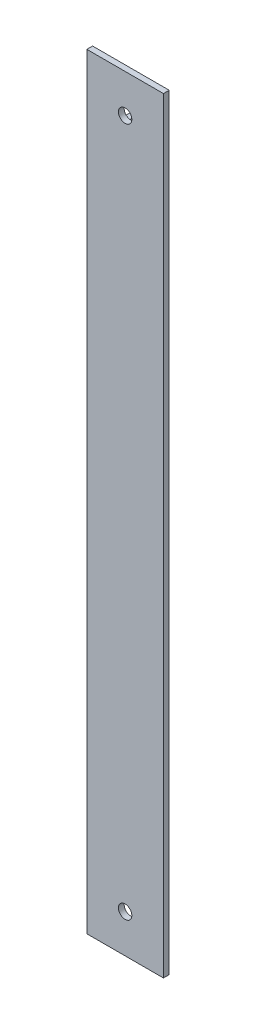
ISO-10303-21;
HEADER;
FILE_DESCRIPTION(('STEP AP214'),'2;1');
FILE_NAME('part.step','',(''),(''),'','','');
FILE_SCHEMA(('AUTOMOTIVE_DESIGN { 1 0 10303 214 1 1 1 1 }'));
ENDSEC;
DATA;
#1=APPLICATION_CONTEXT('core data for automotive mechanical design processes');
#2=APPLICATION_PROTOCOL_DEFINITION('international standard','automotive_design',2000,#1);
#3=PRODUCT_CONTEXT('',#1,'mechanical');
#4=PRODUCT('Part','Part','',(#3));
#5=PRODUCT_RELATED_PRODUCT_CATEGORY('part','',(#4));
#6=PRODUCT_DEFINITION_FORMATION('','',#4);
#7=PRODUCT_DEFINITION_CONTEXT('part definition',#1,'design');
#8=PRODUCT_DEFINITION('design','',#6,#7);
#9=PRODUCT_DEFINITION_SHAPE('','',#8);
#10=(LENGTH_UNIT() NAMED_UNIT(*) SI_UNIT(.MILLI.,.METRE.));
#11=(NAMED_UNIT(*) PLANE_ANGLE_UNIT() SI_UNIT($,.RADIAN.));
#12=(NAMED_UNIT(*) SI_UNIT($,.STERADIAN.) SOLID_ANGLE_UNIT());
#13=UNCERTAINTY_MEASURE_WITH_UNIT(LENGTH_MEASURE(1.E-05),#10,'distance_accuracy_value','');
#14=(GEOMETRIC_REPRESENTATION_CONTEXT(3) GLOBAL_UNCERTAINTY_ASSIGNED_CONTEXT((#13)) GLOBAL_UNIT_ASSIGNED_CONTEXT((#10,
#11,#12)) REPRESENTATION_CONTEXT('',''));
#15=CARTESIAN_POINT('',(0.,0.,0.));
#16=DIRECTION('',(0.,0.,1.));
#17=DIRECTION('',(1.,0.,0.));
#18=AXIS2_PLACEMENT_3D('',#15,#16,#17);
#19=CARTESIAN_POINT('',(1.5,200.,-20.));
#20=DIRECTION('',(-1.,0.,0.));
#21=DIRECTION('',(0.,0.,1.));
#22=AXIS2_PLACEMENT_3D('',#19,#20,#21);
#23=PLANE('',#22);
#24=DIRECTION('',(0.,0.,-1.));
#25=VECTOR('',#24,1.);
#26=CARTESIAN_POINT('',(1.5,20.,-20.));
#27=LINE('',#26,#25);
#28=CARTESIAN_POINT('',(1.5,20.,-1.5));
#29=VERTEX_POINT('',#28);
#30=CARTESIAN_POINT('',(1.5,20.,-20.));
#31=VERTEX_POINT('',#30);
#32=EDGE_CURVE('E126',#29,#31,#27,.T.);
#33=ORIENTED_EDGE('',*,*,#32,.T.);
#34=DIRECTION('',(0.,-1.,0.));
#35=VECTOR('',#34,1.);
#36=CARTESIAN_POINT('',(1.5,200.,-20.));
#37=LINE('',#36,#35);
#38=CARTESIAN_POINT('',(1.5,180.,-20.));
#39=VERTEX_POINT('',#38);
#40=EDGE_CURVE('E125',#39,#31,#37,.T.);
#41=ORIENTED_EDGE('',*,*,#40,.F.);
#42=DIRECTION('',(0.,0.,-1.));
#43=VECTOR('',#42,1.);
#44=CARTESIAN_POINT('',(1.5,180.,-20.));
#45=LINE('',#44,#43);
#46=CARTESIAN_POINT('',(1.5,180.,-1.5));
#47=VERTEX_POINT('',#46);
#48=EDGE_CURVE('E165',#47,#39,#45,.T.);
#49=ORIENTED_EDGE('',*,*,#48,.F.);
#50=DIRECTION('',(0.,-1.,0.));
#51=VECTOR('',#50,1.);
#52=CARTESIAN_POINT('',(1.5,200.,-1.5));
#53=LINE('',#52,#51);
#54=EDGE_CURVE('E135',#47,#29,#53,.T.);
#55=ORIENTED_EDGE('',*,*,#54,.T.);
#56=EDGE_LOOP('',(#33,#41,#49,#55));
#57=FACE_BOUND('',#56,.T.);
#58=ADVANCED_FACE('F35',(#57),#23,.F.);
#59=CARTESIAN_POINT('',(0.,200.,-20.));
#60=DIRECTION('',(0.,0.,1.));
#61=DIRECTION('',(1.,0.,0.));
#62=AXIS2_PLACEMENT_3D('',#59,#60,#61);
#63=PLANE('',#62);
#64=DIRECTION('',(-1.,0.,0.));
#65=VECTOR('',#64,1.);
#66=CARTESIAN_POINT('',(0.,20.,-20.));
#67=LINE('',#66,#65);
#68=CARTESIAN_POINT('',(0.,20.,-20.));
#69=VERTEX_POINT('',#68);
#70=EDGE_CURVE('E111',#31,#69,#67,.T.);
#71=ORIENTED_EDGE('',*,*,#70,.T.);
#72=DIRECTION('',(0.,-1.,0.));
#73=VECTOR('',#72,1.);
#74=CARTESIAN_POINT('',(0.,200.,-20.));
#75=LINE('',#74,#73);
#76=CARTESIAN_POINT('',(0.,180.,-20.));
#77=VERTEX_POINT('',#76);
#78=EDGE_CURVE('E123',#77,#69,#75,.T.);
#79=ORIENTED_EDGE('',*,*,#78,.F.);
#80=DIRECTION('',(-1.,0.,0.));
#81=VECTOR('',#80,1.);
#82=CARTESIAN_POINT('',(0.,180.,-20.));
#83=LINE('',#82,#81);
#84=EDGE_CURVE('E163',#39,#77,#83,.T.);
#85=ORIENTED_EDGE('',*,*,#84,.F.);
#86=ORIENTED_EDGE('',*,*,#40,.T.);
#87=EDGE_LOOP('',(#71,#79,#85,#86));
#88=FACE_BOUND('',#87,.T.);
#89=ADVANCED_FACE('F121',(#88),#63,.F.);
#90=CARTESIAN_POINT('',(0.,200.,0.));
#91=DIRECTION('',(1.,0.,0.));
#92=DIRECTION('',(0.,0.,-1.));
#93=AXIS2_PLACEMENT_3D('',#90,#91,#92);
#94=PLANE('',#93);
#95=DIRECTION('',(0.,-1.,0.));
#96=VECTOR('',#95,1.);
#97=CARTESIAN_POINT('',(0.,20.,-1.5));
#98=LINE('',#97,#96);
#99=CARTESIAN_POINT('',(0.,20.,-1.5));
#100=VERTEX_POINT('',#99);
#101=CARTESIAN_POINT('',(0.,0.,-1.5));
#102=VERTEX_POINT('',#101);
#103=EDGE_CURVE('E176',#100,#102,#98,.T.);
#104=ORIENTED_EDGE('',*,*,#103,.T.);
#105=DIRECTION('',(0.,0.,1.));
#106=VECTOR('',#105,1.);
#107=CARTESIAN_POINT('',(0.,0.,0.));
#108=LINE('',#107,#106);
#109=CARTESIAN_POINT('',(0.,0.,0.));
#110=VERTEX_POINT('',#109);
#111=EDGE_CURVE('E73',#102,#110,#108,.T.);
#112=ORIENTED_EDGE('',*,*,#111,.T.);
#113=DIRECTION('',(0.,-1.,0.));
#114=VECTOR('',#113,1.);
#115=CARTESIAN_POINT('',(0.,200.,0.));
#116=LINE('',#115,#114);
#117=CARTESIAN_POINT('',(0.,200.,0.));
#118=VERTEX_POINT('',#117);
#119=EDGE_CURVE('E133',#118,#110,#116,.T.);
#120=ORIENTED_EDGE('',*,*,#119,.F.);
#121=DIRECTION('',(0.,0.,1.));
#122=VECTOR('',#121,1.);
#123=CARTESIAN_POINT('',(0.,200.,0.));
#124=LINE('',#123,#122);
#125=CARTESIAN_POINT('',(0.,200.,-1.5));
#126=VERTEX_POINT('',#125);
#127=EDGE_CURVE('E56',#126,#118,#124,.T.);
#128=ORIENTED_EDGE('',*,*,#127,.F.);
#129=DIRECTION('',(0.,1.,0.));
#130=VECTOR('',#129,1.);
#131=CARTESIAN_POINT('',(0.,180.,-1.5));
#132=LINE('',#131,#130);
#133=CARTESIAN_POINT('',(0.,180.,-1.5));
#134=VERTEX_POINT('',#133);
#135=EDGE_CURVE('E157',#134,#126,#132,.T.);
#136=ORIENTED_EDGE('',*,*,#135,.F.);
#137=DIRECTION('',(0.,0.,1.));
#138=VECTOR('',#137,1.);
#139=CARTESIAN_POINT('',(0.,180.,-20.));
#140=LINE('',#139,#138);
#141=EDGE_CURVE('E132',#77,#134,#140,.T.);
#142=ORIENTED_EDGE('',*,*,#141,.F.);
#143=ORIENTED_EDGE('',*,*,#78,.T.);
#144=DIRECTION('',(0.,0.,1.));
#145=VECTOR('',#144,1.);
#146=CARTESIAN_POINT('',(0.,20.,-20.));
#147=LINE('',#146,#145);
#148=EDGE_CURVE('E107',#69,#100,#147,.T.);
#149=ORIENTED_EDGE('',*,*,#148,.T.);
#150=EDGE_LOOP('',(#104,#112,#120,#128,#136,#142,#143,#149));
#151=FACE_BOUND('',#150,.T.);
#152=ADVANCED_FACE('F129',(#151),#94,.F.);
#153=CARTESIAN_POINT('',(0.,0.,0.));
#154=DIRECTION('',(0.,-1.,0.));
#155=DIRECTION('',(0.,0.,-1.));
#156=AXIS2_PLACEMENT_3D('',#153,#154,#155);
#157=PLANE('',#156);
#158=ORIENTED_EDGE('',*,*,#111,.F.);
#159=DIRECTION('',(-1.,0.,0.));
#160=VECTOR('',#159,1.);
#161=CARTESIAN_POINT('',(1.5,0.,-1.5));
#162=LINE('',#161,#160);
#163=CARTESIAN_POINT('',(20.,0.,-1.5));
#164=VERTEX_POINT('',#163);
#165=EDGE_CURVE('E145',#164,#102,#162,.T.);
#166=ORIENTED_EDGE('',*,*,#165,.F.);
#167=DIRECTION('',(0.,0.,-1.));
#168=VECTOR('',#167,1.);
#169=CARTESIAN_POINT('',(20.,0.,-1.5));
#170=LINE('',#169,#168);
#171=CARTESIAN_POINT('',(20.,0.,0.));
#172=VERTEX_POINT('',#171);
#173=EDGE_CURVE('E149',#172,#164,#170,.T.);
#174=ORIENTED_EDGE('',*,*,#173,.F.);
#175=DIRECTION('',(1.,0.,0.));
#176=VECTOR('',#175,1.);
#177=CARTESIAN_POINT('',(20.,0.,0.));
#178=LINE('',#177,#176);
#179=EDGE_CURVE('E152',#110,#172,#178,.T.);
#180=ORIENTED_EDGE('',*,*,#179,.F.);
#181=EDGE_LOOP('',(#158,#166,#174,#180));
#182=FACE_BOUND('',#181,.T.);
#183=ADVANCED_FACE('F147',(#182),#157,.T.);
#184=CARTESIAN_POINT('',(20.,200.,0.));
#185=DIRECTION('',(0.,0.,-1.));
#186=DIRECTION('',(-1.,0.,0.));
#187=AXIS2_PLACEMENT_3D('',#184,#185,#186);
#188=PLANE('',#187);
#189=CARTESIAN_POINT('',(10.,10.,0.));
#190=DIRECTION('',(0.,0.,-1.));
#191=DIRECTION('',(1.,0.,0.));
#192=AXIS2_PLACEMENT_3D('',#189,#190,#191);
#193=CIRCLE('',#192,1.75);
#194=CARTESIAN_POINT('',(11.75,10.,0.));
#195=VERTEX_POINT('',#194);
#196=EDGE_CURVE('E116',#195,#195,#193,.T.);
#197=ORIENTED_EDGE('',*,*,#196,.T.);
#198=EDGE_LOOP('',(#197));
#199=FACE_BOUND('',#198,.T.);
#200=CARTESIAN_POINT('',(10.,190.,0.));
#201=DIRECTION('',(0.,0.,1.));
#202=DIRECTION('',(1.,0.,0.));
#203=AXIS2_PLACEMENT_3D('',#200,#201,#202);
#204=CIRCLE('',#203,1.75);
#205=CARTESIAN_POINT('',(11.75,190.,0.));
#206=VERTEX_POINT('',#205);
#207=EDGE_CURVE('E173',#206,#206,#204,.T.);
#208=ORIENTED_EDGE('',*,*,#207,.F.);
#209=EDGE_LOOP('',(#208));
#210=FACE_BOUND('',#209,.T.);
#211=ORIENTED_EDGE('',*,*,#179,.T.);
#212=DIRECTION('',(0.,-1.,0.));
#213=VECTOR('',#212,1.);
#214=CARTESIAN_POINT('',(20.,200.,0.));
#215=LINE('',#214,#213);
#216=CARTESIAN_POINT('',(20.,200.,0.));
#217=VERTEX_POINT('',#216);
#218=EDGE_CURVE('E11',#217,#172,#215,.T.);
#219=ORIENTED_EDGE('',*,*,#218,.F.);
#220=DIRECTION('',(1.,0.,0.));
#221=VECTOR('',#220,1.);
#222=CARTESIAN_POINT('',(20.,200.,0.));
#223=LINE('',#222,#221);
#224=EDGE_CURVE('E151',#118,#217,#223,.T.);
#225=ORIENTED_EDGE('',*,*,#224,.F.);
#226=ORIENTED_EDGE('',*,*,#119,.T.);
#227=EDGE_LOOP('',(#211,#219,#225,#226));
#228=FACE_BOUND('',#227,.T.);
#229=ADVANCED_FACE('F37',(#199,#210,#228),#188,.F.);
#230=CARTESIAN_POINT('',(20.,200.,-1.5));
#231=DIRECTION('',(-1.,0.,0.));
#232=DIRECTION('',(0.,0.,1.));
#233=AXIS2_PLACEMENT_3D('',#230,#231,#232);
#234=PLANE('',#233);
#235=ORIENTED_EDGE('',*,*,#173,.T.);
#236=DIRECTION('',(0.,-1.,0.));
#237=VECTOR('',#236,1.);
#238=CARTESIAN_POINT('',(20.,200.,-1.5));
#239=LINE('',#238,#237);
#240=CARTESIAN_POINT('',(20.,200.,-1.5));
#241=VERTEX_POINT('',#240);
#242=EDGE_CURVE('E43',#241,#164,#239,.T.);
#243=ORIENTED_EDGE('',*,*,#242,.F.);
#244=DIRECTION('',(0.,0.,-1.));
#245=VECTOR('',#244,1.);
#246=CARTESIAN_POINT('',(20.,200.,-1.5));
#247=LINE('',#246,#245);
#248=EDGE_CURVE('E78',#217,#241,#247,.T.);
#249=ORIENTED_EDGE('',*,*,#248,.F.);
#250=ORIENTED_EDGE('',*,*,#218,.T.);
#251=EDGE_LOOP('',(#235,#243,#249,#250));
#252=FACE_BOUND('',#251,.T.);
#253=ADVANCED_FACE('F197',(#252),#234,.F.);
#254=CARTESIAN_POINT('',(1.5,200.,-1.5));
#255=DIRECTION('',(0.,0.,1.));
#256=DIRECTION('',(1.,0.,0.));
#257=AXIS2_PLACEMENT_3D('',#254,#255,#256);
#258=PLANE('',#257);
#259=CARTESIAN_POINT('',(10.,10.,-1.5));
#260=DIRECTION('',(0.,0.,1.));
#261=DIRECTION('',(1.,0.,0.));
#262=AXIS2_PLACEMENT_3D('',#259,#260,#261);
#263=CIRCLE('',#262,1.75);
#264=CARTESIAN_POINT('',(11.75,10.,-1.5));
#265=VERTEX_POINT('',#264);
#266=EDGE_CURVE('E180',#265,#265,#263,.T.);
#267=ORIENTED_EDGE('',*,*,#266,.T.);
#268=EDGE_LOOP('',(#267));
#269=FACE_BOUND('',#268,.T.);
#270=CARTESIAN_POINT('',(10.,190.,-1.5));
#271=DIRECTION('',(0.,0.,1.));
#272=DIRECTION('',(1.,0.,0.));
#273=AXIS2_PLACEMENT_3D('',#270,#271,#272);
#274=CIRCLE('',#273,1.75);
#275=CARTESIAN_POINT('',(11.75,190.,-1.5));
#276=VERTEX_POINT('',#275);
#277=EDGE_CURVE('E170',#276,#276,#274,.F.);
#278=ORIENTED_EDGE('',*,*,#277,.F.);
#279=EDGE_LOOP('',(#278));
#280=FACE_BOUND('',#279,.T.);
#281=ORIENTED_EDGE('',*,*,#165,.T.);
#282=ORIENTED_EDGE('',*,*,#103,.F.);
#283=DIRECTION('',(1.,0.,0.));
#284=VECTOR('',#283,1.);
#285=CARTESIAN_POINT('',(0.,20.,-1.5));
#286=LINE('',#285,#284);
#287=EDGE_CURVE('E113',#100,#29,#286,.T.);
#288=ORIENTED_EDGE('',*,*,#287,.T.);
#289=ORIENTED_EDGE('',*,*,#54,.F.);
#290=DIRECTION('',(1.,0.,0.));
#291=VECTOR('',#290,1.);
#292=CARTESIAN_POINT('',(0.,180.,-1.5));
#293=LINE('',#292,#291);
#294=EDGE_CURVE('E167',#134,#47,#293,.T.);
#295=ORIENTED_EDGE('',*,*,#294,.F.);
#296=ORIENTED_EDGE('',*,*,#135,.T.);
#297=DIRECTION('',(-1.,0.,0.));
#298=VECTOR('',#297,1.);
#299=CARTESIAN_POINT('',(1.5,200.,-1.5));
#300=LINE('',#299,#298);
#301=EDGE_CURVE('E50',#241,#126,#300,.T.);
#302=ORIENTED_EDGE('',*,*,#301,.F.);
#303=ORIENTED_EDGE('',*,*,#242,.T.);
#304=EDGE_LOOP('',(#281,#282,#288,#289,#295,#296,#302,#303));
#305=FACE_BOUND('',#304,.T.);
#306=ADVANCED_FACE('F144',(#269,#280,#305),#258,.F.);
#307=CARTESIAN_POINT('',(0.,200.,0.));
#308=DIRECTION('',(0.,-1.,0.));
#309=DIRECTION('',(0.,0.,-1.));
#310=AXIS2_PLACEMENT_3D('',#307,#308,#309);
#311=PLANE('',#310);
#312=ORIENTED_EDGE('',*,*,#301,.T.);
#313=ORIENTED_EDGE('',*,*,#127,.T.);
#314=ORIENTED_EDGE('',*,*,#224,.T.);
#315=ORIENTED_EDGE('',*,*,#248,.T.);
#316=EDGE_LOOP('',(#312,#313,#314,#315));
#317=FACE_BOUND('',#316,.T.);
#318=ADVANCED_FACE('F196',(#317),#311,.F.);
#319=CARTESIAN_POINT('',(0.,180.,0.));
#320=DIRECTION('',(0.,1.,0.));
#321=DIRECTION('',(0.,0.,1.));
#322=AXIS2_PLACEMENT_3D('',#319,#320,#321);
#323=PLANE('',#322);
#324=ORIENTED_EDGE('',*,*,#141,.T.);
#325=ORIENTED_EDGE('',*,*,#294,.T.);
#326=ORIENTED_EDGE('',*,*,#48,.T.);
#327=ORIENTED_EDGE('',*,*,#84,.T.);
#328=EDGE_LOOP('',(#324,#325,#326,#327));
#329=FACE_BOUND('',#328,.T.);
#330=ADVANCED_FACE('F203',(#329),#323,.T.);
#331=CARTESIAN_POINT('',(10.,190.,-20.001));
#332=DIRECTION('',(0.,0.,1.));
#333=DIRECTION('',(1.,0.,0.));
#334=AXIS2_PLACEMENT_3D('',#331,#332,#333);
#335=CYLINDRICAL_SURFACE('',#334,1.75);
#336=ORIENTED_EDGE('',*,*,#207,.T.);
#337=EDGE_LOOP('',(#336));
#338=FACE_BOUND('',#337,.T.);
#339=ORIENTED_EDGE('',*,*,#277,.T.);
#340=EDGE_LOOP('',(#339));
#341=FACE_BOUND('',#340,.T.);
#342=ADVANCED_FACE('F201',(#338,#341),#335,.F.);
#343=CARTESIAN_POINT('',(0.,20.,0.));
#344=DIRECTION('',(0.,-1.,0.));
#345=DIRECTION('',(0.,0.,1.));
#346=AXIS2_PLACEMENT_3D('',#343,#344,#345);
#347=PLANE('',#346);
#348=ORIENTED_EDGE('',*,*,#148,.F.);
#349=ORIENTED_EDGE('',*,*,#70,.F.);
#350=ORIENTED_EDGE('',*,*,#32,.F.);
#351=ORIENTED_EDGE('',*,*,#287,.F.);
#352=EDGE_LOOP('',(#348,#349,#350,#351));
#353=FACE_BOUND('',#352,.T.);
#354=ADVANCED_FACE('F109',(#353),#347,.T.);
#355=CARTESIAN_POINT('',(10.,10.,-20.001));
#356=DIRECTION('',(0.,0.,1.));
#357=DIRECTION('',(1.,0.,0.));
#358=AXIS2_PLACEMENT_3D('',#355,#356,#357);
#359=CYLINDRICAL_SURFACE('',#358,1.75);
#360=ORIENTED_EDGE('',*,*,#196,.F.);
#361=EDGE_LOOP('',(#360));
#362=FACE_BOUND('',#361,.T.);
#363=ORIENTED_EDGE('',*,*,#266,.F.);
#364=EDGE_LOOP('',(#363));
#365=FACE_BOUND('',#364,.T.);
#366=ADVANCED_FACE('F188',(#362,#365),#359,.F.);
#367=CLOSED_SHELL('',(#58,#89,#152,#183,#229,#253,#306,#318,#330,#342,#354,#366));
#368=MANIFOLD_SOLID_BREP('B2',#367);
#369=ADVANCED_BREP_SHAPE_REPRESENTATION('',(#18,#368),#14);
#370=SHAPE_DEFINITION_REPRESENTATION(#9,#369);
ENDSEC;
END-ISO-10303-21;
